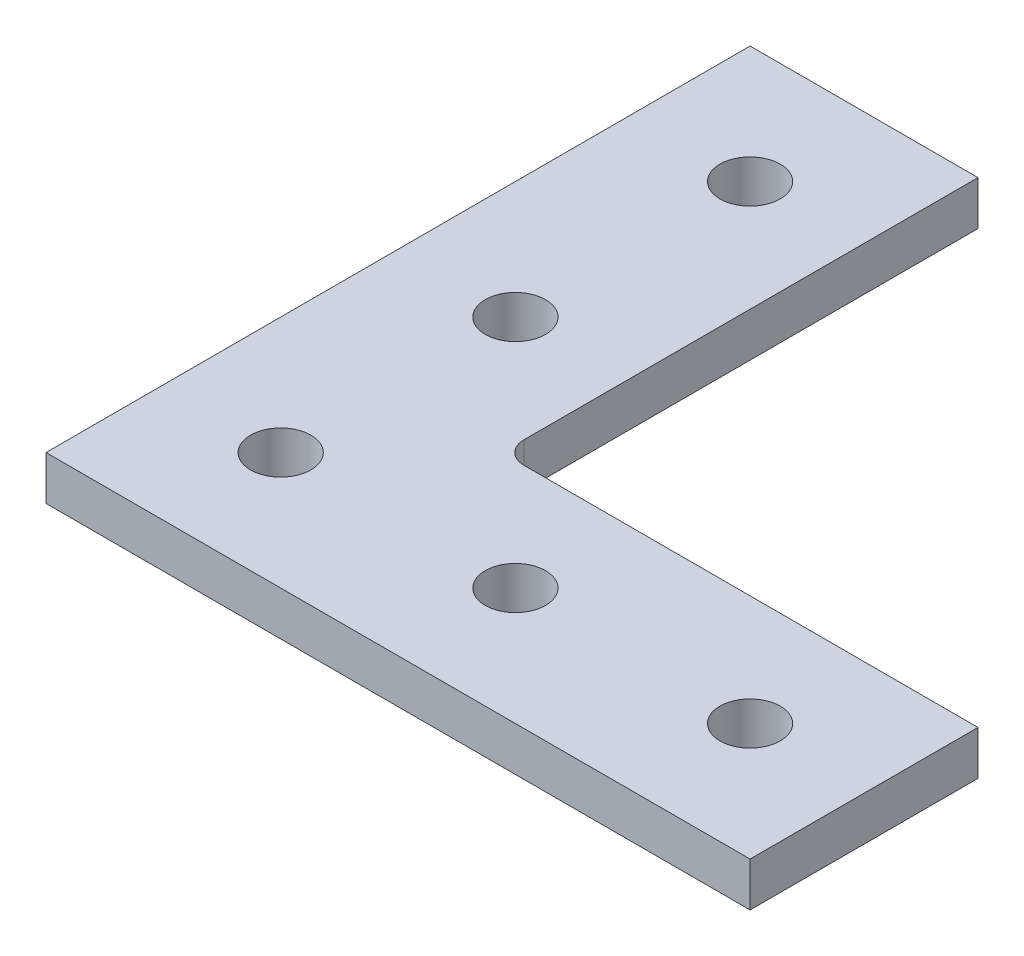
ISO-10303-21;
HEADER;
FILE_DESCRIPTION(('STEP AP214'),'2;1');
FILE_NAME('part.step','',(''),(''),'','','');
FILE_SCHEMA(('AUTOMOTIVE_DESIGN { 1 0 10303 214 1 1 1 1 }'));
ENDSEC;
DATA;
#1=APPLICATION_CONTEXT('core data for automotive mechanical design processes');
#2=APPLICATION_PROTOCOL_DEFINITION('international standard','automotive_design',2000,#1);
#3=PRODUCT_CONTEXT('',#1,'mechanical');
#4=PRODUCT('Part','Part','',(#3));
#5=PRODUCT_RELATED_PRODUCT_CATEGORY('part','',(#4));
#6=PRODUCT_DEFINITION_FORMATION('','',#4);
#7=PRODUCT_DEFINITION_CONTEXT('part definition',#1,'design');
#8=PRODUCT_DEFINITION('design','',#6,#7);
#9=PRODUCT_DEFINITION_SHAPE('','',#8);
#10=(LENGTH_UNIT() NAMED_UNIT(*) SI_UNIT(.MILLI.,.METRE.));
#11=(NAMED_UNIT(*) PLANE_ANGLE_UNIT() SI_UNIT($,.RADIAN.));
#12=(NAMED_UNIT(*) SI_UNIT($,.STERADIAN.) SOLID_ANGLE_UNIT());
#13=UNCERTAINTY_MEASURE_WITH_UNIT(LENGTH_MEASURE(1.E-05),#10,'distance_accuracy_value','');
#14=(GEOMETRIC_REPRESENTATION_CONTEXT(3) GLOBAL_UNCERTAINTY_ASSIGNED_CONTEXT((#13)) GLOBAL_UNIT_ASSIGNED_CONTEXT((#10,
#11,#12)) REPRESENTATION_CONTEXT('',''));
#15=CARTESIAN_POINT('',(0.,0.,0.));
#16=DIRECTION('',(0.,0.,1.));
#17=DIRECTION('',(1.,0.,0.));
#18=AXIS2_PLACEMENT_3D('',#15,#16,#17);
#19=CARTESIAN_POINT('',(27.0482439756275,4.7752,-27.0482439756276));
#20=DIRECTION('',(0.,1.,0.));
#21=DIRECTION('',(0.,0.,1.));
#22=AXIS2_PLACEMENT_3D('',#19,#20,#21);
#23=PLANE('',#22);
#24=CARTESIAN_POINT('',(38.1,4.7752,-12.7000000000001));
#25=DIRECTION('',(0.,1.,0.));
#26=DIRECTION('',(0.,0.,1.));
#27=AXIS2_PLACEMENT_3D('',#24,#25,#26);
#28=CIRCLE('',#27,3.26389999999999);
#29=CARTESIAN_POINT('',(38.1,4.7752,-9.43610000000011));
#30=VERTEX_POINT('',#29);
#31=EDGE_CURVE('E176',#30,#30,#28,.T.);
#32=ORIENTED_EDGE('',*,*,#31,.F.);
#33=EDGE_LOOP('',(#32));
#34=FACE_BOUND('',#33,.T.);
#35=CARTESIAN_POINT('',(12.7,4.7752,-38.1000000000001));
#36=DIRECTION('',(0.,1.,0.));
#37=DIRECTION('',(0.,0.,1.));
#38=AXIS2_PLACEMENT_3D('',#35,#36,#37);
#39=CIRCLE('',#38,3.26390000000001);
#40=CARTESIAN_POINT('',(12.7,4.7752,-34.8361000000001));
#41=VERTEX_POINT('',#40);
#42=EDGE_CURVE('E164',#41,#41,#39,.T.);
#43=ORIENTED_EDGE('',*,*,#42,.F.);
#44=EDGE_LOOP('',(#43));
#45=FACE_BOUND('',#44,.T.);
#46=CARTESIAN_POINT('',(27.0482439756275,4.7752,-27.0482439756276));
#47=DIRECTION('',(0.,-1.,0.));
#48=DIRECTION('',(0.,0.,1.));
#49=AXIS2_PLACEMENT_3D('',#46,#47,#48);
#50=CIRCLE('',#49,2.38125);
#51=CARTESIAN_POINT('',(27.0482439756275,4.7752,-24.6669939756276));
#52=VERTEX_POINT('',#51);
#53=CARTESIAN_POINT('',(24.6669939756275,4.7752,-27.0482439756276));
#54=VERTEX_POINT('',#53);
#55=EDGE_CURVE('E137',#52,#54,#50,.T.);
#56=ORIENTED_EDGE('',*,*,#55,.T.);
#57=DIRECTION('',(0.,0.,-1.));
#58=VECTOR('',#57,1.);
#59=CARTESIAN_POINT('',(24.6669939756275,4.7752,-76.2000000000001));
#60=LINE('',#59,#58);
#61=CARTESIAN_POINT('',(24.6669939756275,4.7752,-76.2000000000001));
#62=VERTEX_POINT('',#61);
#63=EDGE_CURVE('E90',#54,#62,#60,.T.);
#64=ORIENTED_EDGE('',*,*,#63,.T.);
#65=DIRECTION('',(-1.,0.,0.));
#66=VECTOR('',#65,1.);
#67=CARTESIAN_POINT('',(0.,4.7752,-76.2000000000001));
#68=LINE('',#67,#66);
#69=CARTESIAN_POINT('',(0.,4.7752,-76.2000000000001));
#70=VERTEX_POINT('',#69);
#71=EDGE_CURVE('E149',#62,#70,#68,.T.);
#72=ORIENTED_EDGE('',*,*,#71,.T.);
#73=DIRECTION('',(0.,0.,1.));
#74=VECTOR('',#73,1.);
#75=CARTESIAN_POINT('',(0.,4.7752,0.));
#76=LINE('',#75,#74);
#77=CARTESIAN_POINT('',(0.,4.7752,0.));
#78=VERTEX_POINT('',#77);
#79=EDGE_CURVE('E106',#70,#78,#76,.T.);
#80=ORIENTED_EDGE('',*,*,#79,.T.);
#81=DIRECTION('',(1.,0.,0.));
#82=VECTOR('',#81,1.);
#83=CARTESIAN_POINT('',(0.,4.7752,0.));
#84=LINE('',#83,#82);
#85=CARTESIAN_POINT('',(76.2,4.7752,0.));
#86=VERTEX_POINT('',#85);
#87=EDGE_CURVE('E100',#78,#86,#84,.T.);
#88=ORIENTED_EDGE('',*,*,#87,.T.);
#89=DIRECTION('',(0.,0.,-1.));
#90=VECTOR('',#89,1.);
#91=CARTESIAN_POINT('',(76.2,4.7752,-24.6669939756276));
#92=LINE('',#91,#90);
#93=CARTESIAN_POINT('',(76.2,4.7752,-24.6669939756276));
#94=VERTEX_POINT('',#93);
#95=EDGE_CURVE('E104',#86,#94,#92,.T.);
#96=ORIENTED_EDGE('',*,*,#95,.T.);
#97=DIRECTION('',(-1.,0.,0.));
#98=VECTOR('',#97,1.);
#99=CARTESIAN_POINT('',(27.0482439756275,4.7752,-24.6669939756276));
#100=LINE('',#99,#98);
#101=EDGE_CURVE('E50',#94,#52,#100,.T.);
#102=ORIENTED_EDGE('',*,*,#101,.T.);
#103=EDGE_LOOP('',(#56,#64,#72,#80,#88,#96,#102));
#104=FACE_BOUND('',#103,.T.);
#105=CARTESIAN_POINT('',(12.7,4.7752,-63.5000000000001));
#106=DIRECTION('',(0.,1.,0.));
#107=DIRECTION('',(0.,0.,1.));
#108=AXIS2_PLACEMENT_3D('',#105,#106,#107);
#109=CIRCLE('',#108,3.26390000000001);
#110=CARTESIAN_POINT('',(12.7,4.7752,-60.2361000000001));
#111=VERTEX_POINT('',#110);
#112=EDGE_CURVE('E128',#111,#111,#109,.T.);
#113=ORIENTED_EDGE('',*,*,#112,.F.);
#114=EDGE_LOOP('',(#113));
#115=FACE_BOUND('',#114,.T.);
#116=CARTESIAN_POINT('',(12.7,4.7752,-12.7000000000001));
#117=DIRECTION('',(0.,1.,0.));
#118=DIRECTION('',(0.,0.,1.));
#119=AXIS2_PLACEMENT_3D('',#116,#117,#118);
#120=CIRCLE('',#119,3.26390000000001);
#121=CARTESIAN_POINT('',(12.7,4.7752,-9.43610000000009));
#122=VERTEX_POINT('',#121);
#123=EDGE_CURVE('E170',#122,#122,#120,.T.);
#124=ORIENTED_EDGE('',*,*,#123,.F.);
#125=EDGE_LOOP('',(#124));
#126=FACE_BOUND('',#125,.T.);
#127=CARTESIAN_POINT('',(63.5,4.7752,-12.7000000000001));
#128=DIRECTION('',(0.,1.,0.));
#129=DIRECTION('',(0.,0.,1.));
#130=AXIS2_PLACEMENT_3D('',#127,#128,#129);
#131=CIRCLE('',#130,3.26390000000001);
#132=CARTESIAN_POINT('',(63.5,4.7752,-9.43610000000009));
#133=VERTEX_POINT('',#132);
#134=EDGE_CURVE('E182',#133,#133,#131,.T.);
#135=ORIENTED_EDGE('',*,*,#134,.F.);
#136=EDGE_LOOP('',(#135));
#137=FACE_BOUND('',#136,.T.);
#138=ADVANCED_FACE('F33',(#34,#45,#104,#115,#126,#137),#23,.T.);
#139=CARTESIAN_POINT('',(27.0482439756275,0.,-27.0482439756276));
#140=DIRECTION('',(0.,1.,0.));
#141=DIRECTION('',(0.,0.,1.));
#142=AXIS2_PLACEMENT_3D('',#139,#140,#141);
#143=PLANE('',#142);
#144=CARTESIAN_POINT('',(27.0482439756275,0.,-27.0482439756276));
#145=DIRECTION('',(0.,-1.,0.));
#146=DIRECTION('',(0.,0.,1.));
#147=AXIS2_PLACEMENT_3D('',#144,#145,#146);
#148=CIRCLE('',#147,2.38125);
#149=CARTESIAN_POINT('',(27.0482439756275,0.,-24.6669939756276));
#150=VERTEX_POINT('',#149);
#151=CARTESIAN_POINT('',(24.6669939756275,0.,-27.0482439756276));
#152=VERTEX_POINT('',#151);
#153=EDGE_CURVE('E124',#150,#152,#148,.T.);
#154=ORIENTED_EDGE('',*,*,#153,.F.);
#155=DIRECTION('',(-1.,0.,0.));
#156=VECTOR('',#155,1.);
#157=CARTESIAN_POINT('',(27.0482439756275,0.,-24.6669939756276));
#158=LINE('',#157,#156);
#159=CARTESIAN_POINT('',(76.2,0.,-24.6669939756276));
#160=VERTEX_POINT('',#159);
#161=EDGE_CURVE('E82',#160,#150,#158,.T.);
#162=ORIENTED_EDGE('',*,*,#161,.F.);
#163=DIRECTION('',(0.,0.,-1.));
#164=VECTOR('',#163,1.);
#165=CARTESIAN_POINT('',(76.2,0.,-24.6669939756276));
#166=LINE('',#165,#164);
#167=CARTESIAN_POINT('',(76.2,0.,0.));
#168=VERTEX_POINT('',#167);
#169=EDGE_CURVE('E76',#168,#160,#166,.T.);
#170=ORIENTED_EDGE('',*,*,#169,.F.);
#171=DIRECTION('',(1.,0.,0.));
#172=VECTOR('',#171,1.);
#173=CARTESIAN_POINT('',(0.,0.,0.));
#174=LINE('',#173,#172);
#175=CARTESIAN_POINT('',(0.,0.,0.));
#176=VERTEX_POINT('',#175);
#177=EDGE_CURVE('E114',#176,#168,#174,.T.);
#178=ORIENTED_EDGE('',*,*,#177,.F.);
#179=DIRECTION('',(0.,0.,1.));
#180=VECTOR('',#179,1.);
#181=CARTESIAN_POINT('',(0.,0.,0.));
#182=LINE('',#181,#180);
#183=CARTESIAN_POINT('',(0.,0.,-76.2000000000001));
#184=VERTEX_POINT('',#183);
#185=EDGE_CURVE('E132',#184,#176,#182,.T.);
#186=ORIENTED_EDGE('',*,*,#185,.F.);
#187=DIRECTION('',(-1.,0.,0.));
#188=VECTOR('',#187,1.);
#189=CARTESIAN_POINT('',(0.,0.,-76.2000000000001));
#190=LINE('',#189,#188);
#191=CARTESIAN_POINT('',(24.6669939756275,0.,-76.2000000000001));
#192=VERTEX_POINT('',#191);
#193=EDGE_CURVE('E130',#192,#184,#190,.T.);
#194=ORIENTED_EDGE('',*,*,#193,.F.);
#195=DIRECTION('',(0.,0.,-1.));
#196=VECTOR('',#195,1.);
#197=CARTESIAN_POINT('',(24.6669939756275,0.,-76.2000000000001));
#198=LINE('',#197,#196);
#199=EDGE_CURVE('E127',#152,#192,#198,.T.);
#200=ORIENTED_EDGE('',*,*,#199,.F.);
#201=EDGE_LOOP('',(#154,#162,#170,#178,#186,#194,#200));
#202=FACE_BOUND('',#201,.T.);
#203=CARTESIAN_POINT('',(12.7,0.,-63.5000000000001));
#204=DIRECTION('',(0.,1.,0.));
#205=DIRECTION('',(0.,0.,1.));
#206=AXIS2_PLACEMENT_3D('',#203,#204,#205);
#207=CIRCLE('',#206,3.26390000000001);
#208=CARTESIAN_POINT('',(12.7,0.,-60.2361000000001));
#209=VERTEX_POINT('',#208);
#210=EDGE_CURVE('E161',#209,#209,#207,.T.);
#211=ORIENTED_EDGE('',*,*,#210,.T.);
#212=EDGE_LOOP('',(#211));
#213=FACE_BOUND('',#212,.T.);
#214=CARTESIAN_POINT('',(12.7,0.,-38.1000000000001));
#215=DIRECTION('',(0.,1.,0.));
#216=DIRECTION('',(0.,0.,1.));
#217=AXIS2_PLACEMENT_3D('',#214,#215,#216);
#218=CIRCLE('',#217,3.26390000000001);
#219=CARTESIAN_POINT('',(12.7,0.,-34.8361000000001));
#220=VERTEX_POINT('',#219);
#221=EDGE_CURVE('E167',#220,#220,#218,.T.);
#222=ORIENTED_EDGE('',*,*,#221,.T.);
#223=EDGE_LOOP('',(#222));
#224=FACE_BOUND('',#223,.T.);
#225=CARTESIAN_POINT('',(12.7,0.,-12.7000000000001));
#226=DIRECTION('',(0.,1.,0.));
#227=DIRECTION('',(0.,0.,1.));
#228=AXIS2_PLACEMENT_3D('',#225,#226,#227);
#229=CIRCLE('',#228,3.26390000000001);
#230=CARTESIAN_POINT('',(12.7,0.,-9.43610000000009));
#231=VERTEX_POINT('',#230);
#232=EDGE_CURVE('E173',#231,#231,#229,.T.);
#233=ORIENTED_EDGE('',*,*,#232,.T.);
#234=EDGE_LOOP('',(#233));
#235=FACE_BOUND('',#234,.T.);
#236=CARTESIAN_POINT('',(38.1,0.,-12.7000000000001));
#237=DIRECTION('',(0.,1.,0.));
#238=DIRECTION('',(0.,0.,1.));
#239=AXIS2_PLACEMENT_3D('',#236,#237,#238);
#240=CIRCLE('',#239,3.26389999999999);
#241=CARTESIAN_POINT('',(38.1,0.,-9.43610000000011));
#242=VERTEX_POINT('',#241);
#243=EDGE_CURVE('E179',#242,#242,#240,.T.);
#244=ORIENTED_EDGE('',*,*,#243,.T.);
#245=EDGE_LOOP('',(#244));
#246=FACE_BOUND('',#245,.T.);
#247=CARTESIAN_POINT('',(63.5,0.,-12.7000000000001));
#248=DIRECTION('',(0.,1.,0.));
#249=DIRECTION('',(0.,0.,1.));
#250=AXIS2_PLACEMENT_3D('',#247,#248,#249);
#251=CIRCLE('',#250,3.26390000000001);
#252=CARTESIAN_POINT('',(63.5,0.,-9.43610000000009));
#253=VERTEX_POINT('',#252);
#254=EDGE_CURVE('E185',#253,#253,#251,.T.);
#255=ORIENTED_EDGE('',*,*,#254,.T.);
#256=EDGE_LOOP('',(#255));
#257=FACE_BOUND('',#256,.T.);
#258=ADVANCED_FACE('F153',(#202,#213,#224,#235,#246,#257),#143,.F.);
#259=CARTESIAN_POINT('',(27.0482439756275,4.7752,-27.0482439756276));
#260=DIRECTION('',(0.,-1.,0.));
#261=DIRECTION('',(0.,0.,-1.));
#262=AXIS2_PLACEMENT_3D('',#259,#260,#261);
#263=CYLINDRICAL_SURFACE('',#262,2.38125);
#264=ORIENTED_EDGE('',*,*,#153,.T.);
#265=DIRECTION('',(0.,-1.,0.));
#266=VECTOR('',#265,1.);
#267=CARTESIAN_POINT('',(24.6669939756275,4.7752,-27.0482439756276));
#268=LINE('',#267,#266);
#269=EDGE_CURVE('E11',#54,#152,#268,.T.);
#270=ORIENTED_EDGE('',*,*,#269,.F.);
#271=ORIENTED_EDGE('',*,*,#55,.F.);
#272=DIRECTION('',(0.,-1.,0.));
#273=VECTOR('',#272,1.);
#274=CARTESIAN_POINT('',(27.0482439756275,4.7752,-24.6669939756276));
#275=LINE('',#274,#273);
#276=EDGE_CURVE('E120',#52,#150,#275,.T.);
#277=ORIENTED_EDGE('',*,*,#276,.T.);
#278=EDGE_LOOP('',(#264,#270,#271,#277));
#279=FACE_BOUND('',#278,.T.);
#280=ADVANCED_FACE('F35',(#279),#263,.F.);
#281=CARTESIAN_POINT('',(24.6669939756275,4.7752,-76.2000000000001));
#282=DIRECTION('',(-1.,0.,0.));
#283=DIRECTION('',(0.,0.,1.));
#284=AXIS2_PLACEMENT_3D('',#281,#282,#283);
#285=PLANE('',#284);
#286=ORIENTED_EDGE('',*,*,#199,.T.);
#287=DIRECTION('',(0.,-1.,0.));
#288=VECTOR('',#287,1.);
#289=CARTESIAN_POINT('',(24.6669939756275,4.7752,-76.2000000000001));
#290=LINE('',#289,#288);
#291=EDGE_CURVE('E42',#62,#192,#290,.T.);
#292=ORIENTED_EDGE('',*,*,#291,.F.);
#293=ORIENTED_EDGE('',*,*,#63,.F.);
#294=ORIENTED_EDGE('',*,*,#269,.T.);
#295=EDGE_LOOP('',(#286,#292,#293,#294));
#296=FACE_BOUND('',#295,.T.);
#297=ADVANCED_FACE('F217',(#296),#285,.F.);
#298=CARTESIAN_POINT('',(0.,4.7752,-76.2000000000001));
#299=DIRECTION('',(0.,0.,1.));
#300=DIRECTION('',(1.,0.,0.));
#301=AXIS2_PLACEMENT_3D('',#298,#299,#300);
#302=PLANE('',#301);
#303=ORIENTED_EDGE('',*,*,#193,.T.);
#304=DIRECTION('',(0.,-1.,0.));
#305=VECTOR('',#304,1.);
#306=CARTESIAN_POINT('',(0.,4.7752,-76.2000000000001));
#307=LINE('',#306,#305);
#308=EDGE_CURVE('E141',#70,#184,#307,.T.);
#309=ORIENTED_EDGE('',*,*,#308,.F.);
#310=ORIENTED_EDGE('',*,*,#71,.F.);
#311=ORIENTED_EDGE('',*,*,#291,.T.);
#312=EDGE_LOOP('',(#303,#309,#310,#311));
#313=FACE_BOUND('',#312,.T.);
#314=ADVANCED_FACE('F147',(#313),#302,.F.);
#315=CARTESIAN_POINT('',(0.,4.7752,0.));
#316=DIRECTION('',(1.,0.,0.));
#317=DIRECTION('',(0.,0.,-1.));
#318=AXIS2_PLACEMENT_3D('',#315,#316,#317);
#319=PLANE('',#318);
#320=ORIENTED_EDGE('',*,*,#185,.T.);
#321=DIRECTION('',(0.,-1.,0.));
#322=VECTOR('',#321,1.);
#323=CARTESIAN_POINT('',(0.,4.7752,0.));
#324=LINE('',#323,#322);
#325=EDGE_CURVE('E115',#78,#176,#324,.T.);
#326=ORIENTED_EDGE('',*,*,#325,.F.);
#327=ORIENTED_EDGE('',*,*,#79,.F.);
#328=ORIENTED_EDGE('',*,*,#308,.T.);
#329=EDGE_LOOP('',(#320,#326,#327,#328));
#330=FACE_BOUND('',#329,.T.);
#331=ADVANCED_FACE('F156',(#330),#319,.F.);
#332=CARTESIAN_POINT('',(0.,4.7752,0.));
#333=DIRECTION('',(0.,0.,-1.));
#334=DIRECTION('',(-1.,0.,0.));
#335=AXIS2_PLACEMENT_3D('',#332,#333,#334);
#336=PLANE('',#335);
#337=ORIENTED_EDGE('',*,*,#177,.T.);
#338=DIRECTION('',(0.,-1.,0.));
#339=VECTOR('',#338,1.);
#340=CARTESIAN_POINT('',(76.2,4.7752,0.));
#341=LINE('',#340,#339);
#342=EDGE_CURVE('E111',#86,#168,#341,.T.);
#343=ORIENTED_EDGE('',*,*,#342,.F.);
#344=ORIENTED_EDGE('',*,*,#87,.F.);
#345=ORIENTED_EDGE('',*,*,#325,.T.);
#346=EDGE_LOOP('',(#337,#343,#344,#345));
#347=FACE_BOUND('',#346,.T.);
#348=ADVANCED_FACE('F112',(#347),#336,.F.);
#349=CARTESIAN_POINT('',(76.2,4.7752,-24.6669939756276));
#350=DIRECTION('',(-1.,0.,0.));
#351=DIRECTION('',(0.,0.,1.));
#352=AXIS2_PLACEMENT_3D('',#349,#350,#351);
#353=PLANE('',#352);
#354=ORIENTED_EDGE('',*,*,#169,.T.);
#355=DIRECTION('',(0.,-1.,0.));
#356=VECTOR('',#355,1.);
#357=CARTESIAN_POINT('',(76.2,4.7752,-24.6669939756276));
#358=LINE('',#357,#356);
#359=EDGE_CURVE('E116',#94,#160,#358,.T.);
#360=ORIENTED_EDGE('',*,*,#359,.F.);
#361=ORIENTED_EDGE('',*,*,#95,.F.);
#362=ORIENTED_EDGE('',*,*,#342,.T.);
#363=EDGE_LOOP('',(#354,#360,#361,#362));
#364=FACE_BOUND('',#363,.T.);
#365=ADVANCED_FACE('F118',(#364),#353,.F.);
#366=CARTESIAN_POINT('',(27.0482439756275,4.7752,-24.6669939756276));
#367=DIRECTION('',(0.,0.,1.));
#368=DIRECTION('',(1.,0.,0.));
#369=AXIS2_PLACEMENT_3D('',#366,#367,#368);
#370=PLANE('',#369);
#371=ORIENTED_EDGE('',*,*,#161,.T.);
#372=ORIENTED_EDGE('',*,*,#276,.F.);
#373=ORIENTED_EDGE('',*,*,#101,.F.);
#374=ORIENTED_EDGE('',*,*,#359,.T.);
#375=EDGE_LOOP('',(#371,#372,#373,#374));
#376=FACE_BOUND('',#375,.T.);
#377=ADVANCED_FACE('F207',(#376),#370,.F.);
#378=CARTESIAN_POINT('',(12.7,4.7752,-63.5000000000001));
#379=DIRECTION('',(0.,-1.,0.));
#380=DIRECTION('',(0.,0.,-1.));
#381=AXIS2_PLACEMENT_3D('',#378,#379,#380);
#382=CYLINDRICAL_SURFACE('',#381,3.26390000000001);
#383=ORIENTED_EDGE('',*,*,#112,.T.);
#384=EDGE_LOOP('',(#383));
#385=FACE_BOUND('',#384,.T.);
#386=ORIENTED_EDGE('',*,*,#210,.F.);
#387=EDGE_LOOP('',(#386));
#388=FACE_BOUND('',#387,.T.);
#389=ADVANCED_FACE('F204',(#385,#388),#382,.F.);
#390=CARTESIAN_POINT('',(12.7,4.7752,-38.1000000000001));
#391=DIRECTION('',(0.,-1.,0.));
#392=DIRECTION('',(0.,0.,-1.));
#393=AXIS2_PLACEMENT_3D('',#390,#391,#392);
#394=CYLINDRICAL_SURFACE('',#393,3.26390000000001);
#395=ORIENTED_EDGE('',*,*,#42,.T.);
#396=EDGE_LOOP('',(#395));
#397=FACE_BOUND('',#396,.T.);
#398=ORIENTED_EDGE('',*,*,#221,.F.);
#399=EDGE_LOOP('',(#398));
#400=FACE_BOUND('',#399,.T.);
#401=ADVANCED_FACE('F276',(#397,#400),#394,.F.);
#402=CARTESIAN_POINT('',(12.7,4.7752,-12.7000000000001));
#403=DIRECTION('',(0.,-1.,0.));
#404=DIRECTION('',(0.,0.,-1.));
#405=AXIS2_PLACEMENT_3D('',#402,#403,#404);
#406=CYLINDRICAL_SURFACE('',#405,3.26390000000001);
#407=ORIENTED_EDGE('',*,*,#123,.T.);
#408=EDGE_LOOP('',(#407));
#409=FACE_BOUND('',#408,.T.);
#410=ORIENTED_EDGE('',*,*,#232,.F.);
#411=EDGE_LOOP('',(#410));
#412=FACE_BOUND('',#411,.T.);
#413=ADVANCED_FACE('F284',(#409,#412),#406,.F.);
#414=CARTESIAN_POINT('',(38.1,4.7752,-12.7000000000001));
#415=DIRECTION('',(0.,-1.,0.));
#416=DIRECTION('',(0.,0.,-1.));
#417=AXIS2_PLACEMENT_3D('',#414,#415,#416);
#418=CYLINDRICAL_SURFACE('',#417,3.26389999999999);
#419=ORIENTED_EDGE('',*,*,#31,.T.);
#420=EDGE_LOOP('',(#419));
#421=FACE_BOUND('',#420,.T.);
#422=ORIENTED_EDGE('',*,*,#243,.F.);
#423=EDGE_LOOP('',(#422));
#424=FACE_BOUND('',#423,.T.);
#425=ADVANCED_FACE('F292',(#421,#424),#418,.F.);
#426=CARTESIAN_POINT('',(63.5,4.7752,-12.7000000000001));
#427=DIRECTION('',(0.,-1.,0.));
#428=DIRECTION('',(0.,0.,-1.));
#429=AXIS2_PLACEMENT_3D('',#426,#427,#428);
#430=CYLINDRICAL_SURFACE('',#429,3.26390000000001);
#431=ORIENTED_EDGE('',*,*,#134,.T.);
#432=EDGE_LOOP('',(#431));
#433=FACE_BOUND('',#432,.T.);
#434=ORIENTED_EDGE('',*,*,#254,.F.);
#435=EDGE_LOOP('',(#434));
#436=FACE_BOUND('',#435,.T.);
#437=ADVANCED_FACE('F191',(#433,#436),#430,.F.);
#438=CLOSED_SHELL('',(#138,#258,#280,#297,#314,#331,#348,#365,#377,#389,#401,#413,#425,#437));
#439=MANIFOLD_SOLID_BREP('B2',#438);
#440=ADVANCED_BREP_SHAPE_REPRESENTATION('',(#18,#439),#14);
#441=SHAPE_DEFINITION_REPRESENTATION(#9,#440);
ENDSEC;
END-ISO-10303-21;
